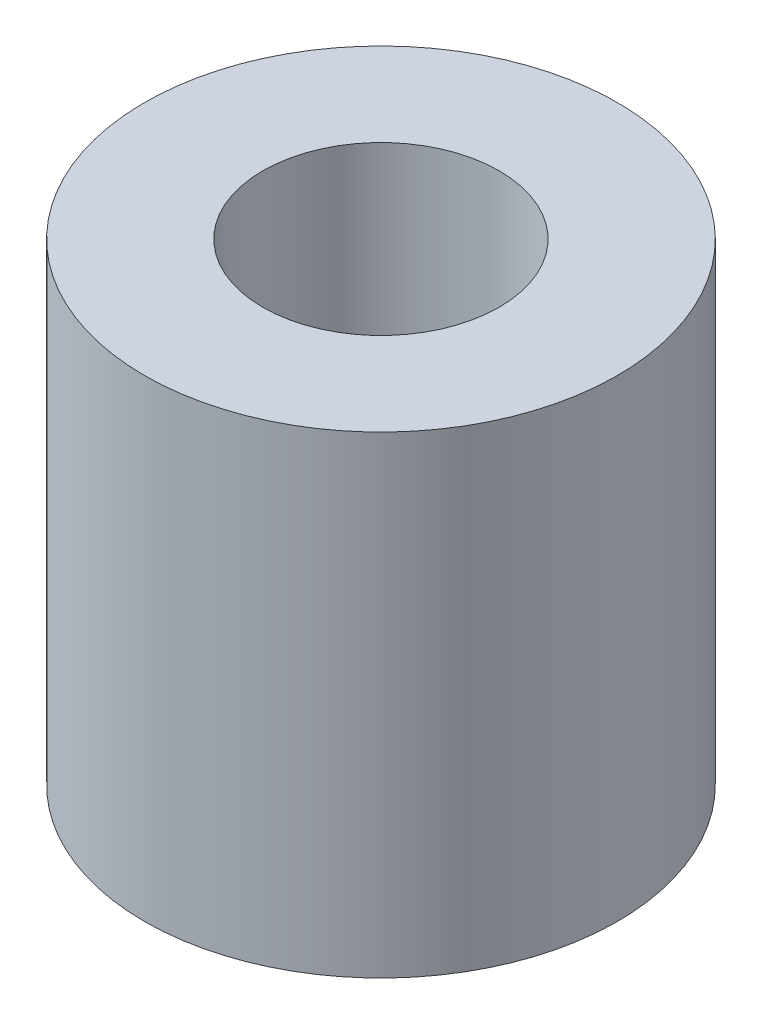
ISO-10303-21;
HEADER;
FILE_DESCRIPTION(('STEP AP214'),'2;1');
FILE_NAME('part.step','',(''),(''),'','','');
FILE_SCHEMA(('AUTOMOTIVE_DESIGN { 1 0 10303 214 1 1 1 1 }'));
ENDSEC;
DATA;
#1=APPLICATION_CONTEXT('core data for automotive mechanical design processes');
#2=APPLICATION_PROTOCOL_DEFINITION('international standard','automotive_design',2000,#1);
#3=PRODUCT_CONTEXT('',#1,'mechanical');
#4=PRODUCT('Part','Part','',(#3));
#5=PRODUCT_RELATED_PRODUCT_CATEGORY('part','',(#4));
#6=PRODUCT_DEFINITION_FORMATION('','',#4);
#7=PRODUCT_DEFINITION_CONTEXT('part definition',#1,'design');
#8=PRODUCT_DEFINITION('design','',#6,#7);
#9=PRODUCT_DEFINITION_SHAPE('','',#8);
#10=(LENGTH_UNIT() NAMED_UNIT(*) SI_UNIT(.MILLI.,.METRE.));
#11=(NAMED_UNIT(*) PLANE_ANGLE_UNIT() SI_UNIT($,.RADIAN.));
#12=(NAMED_UNIT(*) SI_UNIT($,.STERADIAN.) SOLID_ANGLE_UNIT());
#13=UNCERTAINTY_MEASURE_WITH_UNIT(LENGTH_MEASURE(1.E-05),#10,'distance_accuracy_value','');
#14=(GEOMETRIC_REPRESENTATION_CONTEXT(3) GLOBAL_UNCERTAINTY_ASSIGNED_CONTEXT((#13)) GLOBAL_UNIT_ASSIGNED_CONTEXT((#10,
#11,#12)) REPRESENTATION_CONTEXT('',''));
#15=CARTESIAN_POINT('',(0.,0.,0.));
#16=DIRECTION('',(0.,0.,1.));
#17=DIRECTION('',(1.,0.,0.));
#18=AXIS2_PLACEMENT_3D('',#15,#16,#17);
#19=CARTESIAN_POINT('',(0.,-80.,0.));
#20=DIRECTION('',(0.,1.,0.));
#21=DIRECTION('',(0.,0.,1.));
#22=AXIS2_PLACEMENT_3D('',#19,#20,#21);
#23=CYLINDRICAL_SURFACE('',#22,40.);
#24=CARTESIAN_POINT('',(0.,-80.,0.));
#25=DIRECTION('',(0.,1.,0.));
#26=DIRECTION('',(0.,0.,1.));
#27=AXIS2_PLACEMENT_3D('',#24,#25,#26);
#28=CIRCLE('',#27,40.);
#29=CARTESIAN_POINT('',(0.,-80.,40.));
#30=VERTEX_POINT('',#29);
#31=EDGE_CURVE('E10',#30,#30,#28,.T.);
#32=ORIENTED_EDGE('',*,*,#31,.T.);
#33=EDGE_LOOP('',(#32));
#34=FACE_BOUND('',#33,.T.);
#35=CARTESIAN_POINT('',(0.,0.,0.));
#36=DIRECTION('',(0.,1.,0.));
#37=DIRECTION('',(0.,0.,1.));
#38=AXIS2_PLACEMENT_3D('',#35,#36,#37);
#39=CIRCLE('',#38,40.);
#40=CARTESIAN_POINT('',(0.,0.,40.));
#41=VERTEX_POINT('',#40);
#42=EDGE_CURVE('E34',#41,#41,#39,.T.);
#43=ORIENTED_EDGE('',*,*,#42,.F.);
#44=EDGE_LOOP('',(#43));
#45=FACE_BOUND('',#44,.T.);
#46=ADVANCED_FACE('F31',(#34,#45),#23,.T.);
#47=CARTESIAN_POINT('',(0.,-80.,0.));
#48=DIRECTION('',(0.,1.,0.));
#49=DIRECTION('',(0.,0.,1.));
#50=AXIS2_PLACEMENT_3D('',#47,#48,#49);
#51=PLANE('',#50);
#52=CARTESIAN_POINT('',(0.,-80.,0.));
#53=DIRECTION('',(0.,1.,0.));
#54=DIRECTION('',(0.,0.,1.));
#55=AXIS2_PLACEMENT_3D('',#52,#53,#54);
#56=CIRCLE('',#55,20.);
#57=CARTESIAN_POINT('',(0.,-80.,20.));
#58=VERTEX_POINT('',#57);
#59=EDGE_CURVE('E41',#58,#58,#56,.T.);
#60=ORIENTED_EDGE('',*,*,#59,.T.);
#61=EDGE_LOOP('',(#60));
#62=FACE_BOUND('',#61,.T.);
#63=ORIENTED_EDGE('',*,*,#31,.F.);
#64=EDGE_LOOP('',(#63));
#65=FACE_BOUND('',#64,.T.);
#66=ADVANCED_FACE('F49',(#62,#65),#51,.F.);
#67=CARTESIAN_POINT('',(0.,0.,0.));
#68=DIRECTION('',(0.,1.,0.));
#69=DIRECTION('',(0.,0.,1.));
#70=AXIS2_PLACEMENT_3D('',#67,#68,#69);
#71=PLANE('',#70);
#72=CARTESIAN_POINT('',(0.,0.,0.));
#73=DIRECTION('',(0.,1.,0.));
#74=DIRECTION('',(0.,0.,1.));
#75=AXIS2_PLACEMENT_3D('',#72,#73,#74);
#76=CIRCLE('',#75,20.);
#77=CARTESIAN_POINT('',(0.,0.,20.));
#78=VERTEX_POINT('',#77);
#79=EDGE_CURVE('E43',#78,#78,#76,.T.);
#80=ORIENTED_EDGE('',*,*,#79,.F.);
#81=EDGE_LOOP('',(#80));
#82=FACE_BOUND('',#81,.T.);
#83=ORIENTED_EDGE('',*,*,#42,.T.);
#84=EDGE_LOOP('',(#83));
#85=FACE_BOUND('',#84,.T.);
#86=ADVANCED_FACE('F55',(#82,#85),#71,.T.);
#87=CARTESIAN_POINT('',(0.,-80.,0.));
#88=DIRECTION('',(0.,1.,0.));
#89=DIRECTION('',(0.,0.,1.));
#90=AXIS2_PLACEMENT_3D('',#87,#88,#89);
#91=CYLINDRICAL_SURFACE('',#90,20.);
#92=ORIENTED_EDGE('',*,*,#59,.F.);
#93=EDGE_LOOP('',(#92));
#94=FACE_BOUND('',#93,.T.);
#95=ORIENTED_EDGE('',*,*,#79,.T.);
#96=EDGE_LOOP('',(#95));
#97=FACE_BOUND('',#96,.T.);
#98=ADVANCED_FACE('F52',(#94,#97),#91,.F.);
#99=CLOSED_SHELL('',(#46,#66,#86,#98));
#100=MANIFOLD_SOLID_BREP('B2',#99);
#101=ADVANCED_BREP_SHAPE_REPRESENTATION('',(#18,#100),#14);
#102=SHAPE_DEFINITION_REPRESENTATION(#9,#101);
ENDSEC;
END-ISO-10303-21;
